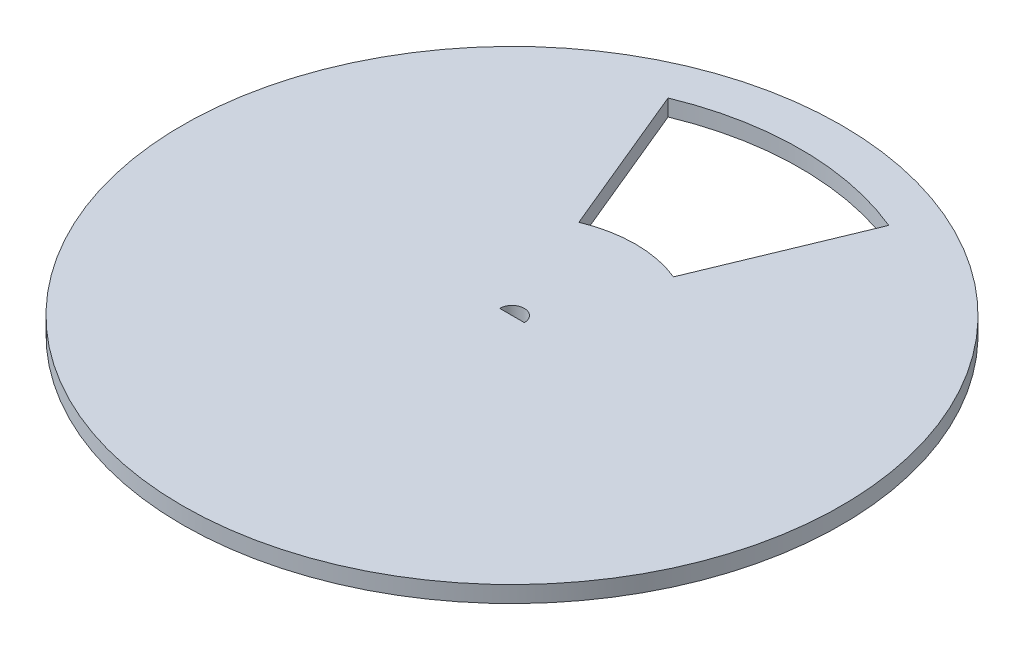
ISO-10303-21;
HEADER;
FILE_DESCRIPTION(('STEP AP214'),'2;1');
FILE_NAME('part.step','',(''),(''),'','','');
FILE_SCHEMA(('AUTOMOTIVE_DESIGN { 1 0 10303 214 1 1 1 1 }'));
ENDSEC;
DATA;
#1=APPLICATION_CONTEXT('core data for automotive mechanical design processes');
#2=APPLICATION_PROTOCOL_DEFINITION('international standard','automotive_design',2000,#1);
#3=PRODUCT_CONTEXT('',#1,'mechanical');
#4=PRODUCT('Part','Part','',(#3));
#5=PRODUCT_RELATED_PRODUCT_CATEGORY('part','',(#4));
#6=PRODUCT_DEFINITION_FORMATION('','',#4);
#7=PRODUCT_DEFINITION_CONTEXT('part definition',#1,'design');
#8=PRODUCT_DEFINITION('design','',#6,#7);
#9=PRODUCT_DEFINITION_SHAPE('','',#8);
#10=(LENGTH_UNIT() NAMED_UNIT(*) SI_UNIT(.MILLI.,.METRE.));
#11=(NAMED_UNIT(*) PLANE_ANGLE_UNIT() SI_UNIT($,.RADIAN.));
#12=(NAMED_UNIT(*) SI_UNIT($,.STERADIAN.) SOLID_ANGLE_UNIT());
#13=UNCERTAINTY_MEASURE_WITH_UNIT(LENGTH_MEASURE(1.E-05),#10,'distance_accuracy_value','');
#14=(GEOMETRIC_REPRESENTATION_CONTEXT(3) GLOBAL_UNCERTAINTY_ASSIGNED_CONTEXT((#13)) GLOBAL_UNIT_ASSIGNED_CONTEXT((#10,
#11,#12)) REPRESENTATION_CONTEXT('',''));
#15=CARTESIAN_POINT('',(0.,0.,0.));
#16=DIRECTION('',(0.,0.,1.));
#17=DIRECTION('',(1.,0.,0.));
#18=AXIS2_PLACEMENT_3D('',#15,#16,#17);
#19=CARTESIAN_POINT('',(0.,2.,0.));
#20=DIRECTION('',(0.,-1.,0.));
#21=DIRECTION('',(0.,0.,-1.));
#22=AXIS2_PLACEMENT_3D('',#19,#20,#21);
#23=CYLINDRICAL_SURFACE('',#22,40.);
#24=CARTESIAN_POINT('',(0.,2.,0.));
#25=DIRECTION('',(0.,1.,0.));
#26=DIRECTION('',(0.,0.,1.));
#27=AXIS2_PLACEMENT_3D('',#24,#25,#26);
#28=CIRCLE('',#27,40.);
#29=CARTESIAN_POINT('',(0.,2.,40.));
#30=VERTEX_POINT('',#29);
#31=EDGE_CURVE('E11',#30,#30,#28,.T.);
#32=ORIENTED_EDGE('',*,*,#31,.F.);
#33=EDGE_LOOP('',(#32));
#34=FACE_BOUND('',#33,.T.);
#35=CARTESIAN_POINT('',(0.,0.,0.));
#36=DIRECTION('',(0.,1.,0.));
#37=DIRECTION('',(0.,0.,1.));
#38=AXIS2_PLACEMENT_3D('',#35,#36,#37);
#39=CIRCLE('',#38,40.);
#40=CARTESIAN_POINT('',(0.,0.,40.));
#41=VERTEX_POINT('',#40);
#42=EDGE_CURVE('E42',#41,#41,#39,.T.);
#43=ORIENTED_EDGE('',*,*,#42,.T.);
#44=EDGE_LOOP('',(#43));
#45=FACE_BOUND('',#44,.T.);
#46=ADVANCED_FACE('F39',(#34,#45),#23,.T.);
#47=CARTESIAN_POINT('',(0.,2.,0.));
#48=DIRECTION('',(0.,1.,0.));
#49=DIRECTION('',(0.,0.,1.));
#50=AXIS2_PLACEMENT_3D('',#47,#48,#49);
#51=PLANE('',#50);
#52=CARTESIAN_POINT('',(0.,2.,0.));
#53=DIRECTION('',(0.,1.,0.));
#54=DIRECTION('',(0.,0.,-1.));
#55=AXIS2_PLACEMENT_3D('',#52,#53,#54);
#56=CIRCLE('',#55,1.5);
#57=CARTESIAN_POINT('',(1.5,2.,0.));
#58=VERTEX_POINT('',#57);
#59=CARTESIAN_POINT('',(-1.5,2.,0.));
#60=VERTEX_POINT('',#59);
#61=EDGE_CURVE('E54',#58,#60,#56,.T.);
#62=ORIENTED_EDGE('',*,*,#61,.F.);
#63=DIRECTION('',(1.,0.,0.));
#64=VECTOR('',#63,1.);
#65=CARTESIAN_POINT('',(-1.5,2.,0.));
#66=LINE('',#65,#64);
#67=EDGE_CURVE('E106',#60,#58,#66,.T.);
#68=ORIENTED_EDGE('',*,*,#67,.F.);
#69=EDGE_LOOP('',(#62,#68));
#70=FACE_BOUND('',#69,.T.);
#71=CARTESIAN_POINT('',(0.,2.,0.));
#72=DIRECTION('',(0.,1.,0.));
#73=DIRECTION('',(0.,0.,-1.));
#74=AXIS2_PLACEMENT_3D('',#71,#72,#73);
#75=CIRCLE('',#74,35.);
#76=CARTESIAN_POINT('',(13.3939201327782,2.,-32.335783637895));
#77=VERTEX_POINT('',#76);
#78=CARTESIAN_POINT('',(-13.3939201327782,2.,-32.335783637895));
#79=VERTEX_POINT('',#78);
#80=EDGE_CURVE('E126',#77,#79,#75,.T.);
#81=ORIENTED_EDGE('',*,*,#80,.F.);
#82=DIRECTION('',(0.382683432365091,0.,-0.923879532511287));
#83=VECTOR('',#82,1.);
#84=CARTESIAN_POINT('',(13.3939201327782,2.,-32.335783637895));
#85=LINE('',#84,#83);
#86=CARTESIAN_POINT('',(5.74025148547637,2.,-13.8581929876693));
#87=VERTEX_POINT('',#86);
#88=EDGE_CURVE('E137',#87,#77,#85,.T.);
#89=ORIENTED_EDGE('',*,*,#88,.F.);
#90=CARTESIAN_POINT('',(0.,2.,0.));
#91=DIRECTION('',(0.,-1.,0.));
#92=DIRECTION('',(0.,0.,1.));
#93=AXIS2_PLACEMENT_3D('',#90,#91,#92);
#94=CIRCLE('',#93,15.);
#95=CARTESIAN_POINT('',(-5.74025148547636,2.,-13.8581929876693));
#96=VERTEX_POINT('',#95);
#97=EDGE_CURVE('E133',#96,#87,#94,.T.);
#98=ORIENTED_EDGE('',*,*,#97,.F.);
#99=DIRECTION('',(0.382683432365091,0.,0.923879532511287));
#100=VECTOR('',#99,1.);
#101=CARTESIAN_POINT('',(-5.74025148547636,2.,-13.8581929876693));
#102=LINE('',#101,#100);
#103=EDGE_CURVE('E129',#79,#96,#102,.T.);
#104=ORIENTED_EDGE('',*,*,#103,.F.);
#105=EDGE_LOOP('',(#81,#89,#98,#104));
#106=FACE_BOUND('',#105,.T.);
#107=ORIENTED_EDGE('',*,*,#31,.T.);
#108=EDGE_LOOP('',(#107));
#109=FACE_BOUND('',#108,.T.);
#110=ADVANCED_FACE('F168',(#70,#106,#109),#51,.T.);
#111=CARTESIAN_POINT('',(0.,0.,0.));
#112=DIRECTION('',(0.,1.,0.));
#113=DIRECTION('',(0.,0.,1.));
#114=AXIS2_PLACEMENT_3D('',#111,#112,#113);
#115=PLANE('',#114);
#116=DIRECTION('',(1.,0.,0.));
#117=VECTOR('',#116,1.);
#118=CARTESIAN_POINT('',(-1.5,0.,0.));
#119=LINE('',#118,#117);
#120=CARTESIAN_POINT('',(-1.5,0.,0.));
#121=VERTEX_POINT('',#120);
#122=CARTESIAN_POINT('',(1.5,0.,0.));
#123=VERTEX_POINT('',#122);
#124=EDGE_CURVE('E96',#121,#123,#119,.T.);
#125=ORIENTED_EDGE('',*,*,#124,.T.);
#126=CARTESIAN_POINT('',(0.,0.,0.));
#127=DIRECTION('',(0.,1.,0.));
#128=DIRECTION('',(0.,0.,-1.));
#129=AXIS2_PLACEMENT_3D('',#126,#127,#128);
#130=CIRCLE('',#129,1.5);
#131=EDGE_CURVE('E59',#123,#121,#130,.T.);
#132=ORIENTED_EDGE('',*,*,#131,.T.);
#133=EDGE_LOOP('',(#125,#132));
#134=FACE_BOUND('',#133,.T.);
#135=DIRECTION('',(-0.382683432365091,0.,0.923879532511287));
#136=VECTOR('',#135,1.);
#137=CARTESIAN_POINT('',(13.3939201327782,0.,-32.335783637895));
#138=LINE('',#137,#136);
#139=CARTESIAN_POINT('',(13.3939201327782,0.,-32.335783637895));
#140=VERTEX_POINT('',#139);
#141=CARTESIAN_POINT('',(5.74025148547637,0.,-13.8581929876693));
#142=VERTEX_POINT('',#141);
#143=EDGE_CURVE('E118',#140,#142,#138,.T.);
#144=ORIENTED_EDGE('',*,*,#143,.F.);
#145=CARTESIAN_POINT('',(0.,0.,0.));
#146=DIRECTION('',(0.,1.,0.));
#147=DIRECTION('',(0.,0.,1.));
#148=AXIS2_PLACEMENT_3D('',#145,#146,#147);
#149=CIRCLE('',#148,35.);
#150=CARTESIAN_POINT('',(-13.3939201327782,0.,-32.335783637895));
#151=VERTEX_POINT('',#150);
#152=EDGE_CURVE('E122',#151,#140,#149,.F.);
#153=ORIENTED_EDGE('',*,*,#152,.F.);
#154=DIRECTION('',(-0.382683432365091,0.,-0.923879532511287));
#155=VECTOR('',#154,1.);
#156=CARTESIAN_POINT('',(-5.74025148547636,0.,-13.8581929876693));
#157=LINE('',#156,#155);
#158=CARTESIAN_POINT('',(-5.74025148547636,0.,-13.8581929876693));
#159=VERTEX_POINT('',#158);
#160=EDGE_CURVE('E145',#159,#151,#157,.T.);
#161=ORIENTED_EDGE('',*,*,#160,.F.);
#162=CARTESIAN_POINT('',(0.,0.,0.));
#163=DIRECTION('',(0.,1.,0.));
#164=DIRECTION('',(0.,0.,1.));
#165=AXIS2_PLACEMENT_3D('',#162,#163,#164);
#166=CIRCLE('',#165,15.);
#167=EDGE_CURVE('E114',#142,#159,#166,.T.);
#168=ORIENTED_EDGE('',*,*,#167,.F.);
#169=EDGE_LOOP('',(#144,#153,#161,#168));
#170=FACE_BOUND('',#169,.T.);
#171=ORIENTED_EDGE('',*,*,#42,.F.);
#172=EDGE_LOOP('',(#171));
#173=FACE_BOUND('',#172,.T.);
#174=ADVANCED_FACE('F103',(#134,#170,#173),#115,.F.);
#175=CARTESIAN_POINT('',(0.,-0.00100000000000013,0.));
#176=DIRECTION('',(0.,1.,0.));
#177=DIRECTION('',(0.,0.,1.));
#178=AXIS2_PLACEMENT_3D('',#175,#176,#177);
#179=CYLINDRICAL_SURFACE('',#178,35.);
#180=ORIENTED_EDGE('',*,*,#152,.T.);
#181=DIRECTION('',(0.,1.,0.));
#182=VECTOR('',#181,1.);
#183=CARTESIAN_POINT('',(13.3939201327782,-0.00100000000000013,-32.335783637895));
#184=LINE('',#183,#182);
#185=EDGE_CURVE('E142',#140,#77,#184,.T.);
#186=ORIENTED_EDGE('',*,*,#185,.T.);
#187=ORIENTED_EDGE('',*,*,#80,.T.);
#188=DIRECTION('',(0.,1.,0.));
#189=VECTOR('',#188,1.);
#190=CARTESIAN_POINT('',(-13.3939201327782,-0.00100000000000013,-32.335783637895));
#191=LINE('',#190,#189);
#192=EDGE_CURVE('E141',#151,#79,#191,.T.);
#193=ORIENTED_EDGE('',*,*,#192,.F.);
#194=EDGE_LOOP('',(#180,#186,#187,#193));
#195=FACE_BOUND('',#194,.T.);
#196=ADVANCED_FACE('F167',(#195),#179,.F.);
#197=CARTESIAN_POINT('',(13.3939201327782,-0.00100000000000013,-32.335783637895));
#198=DIRECTION('',(0.923879532511287,0.,0.382683432365091));
#199=DIRECTION('',(0.382683432365091,0.,-0.923879532511287));
#200=AXIS2_PLACEMENT_3D('',#197,#198,#199);
#201=PLANE('',#200);
#202=ORIENTED_EDGE('',*,*,#143,.T.);
#203=DIRECTION('',(0.,1.,0.));
#204=VECTOR('',#203,1.);
#205=CARTESIAN_POINT('',(5.74025148547637,-0.00100000000000013,-13.8581929876693));
#206=LINE('',#205,#204);
#207=EDGE_CURVE('E146',#142,#87,#206,.T.);
#208=ORIENTED_EDGE('',*,*,#207,.T.);
#209=ORIENTED_EDGE('',*,*,#88,.T.);
#210=ORIENTED_EDGE('',*,*,#185,.F.);
#211=EDGE_LOOP('',(#202,#208,#209,#210));
#212=FACE_BOUND('',#211,.T.);
#213=ADVANCED_FACE('F173',(#212),#201,.F.);
#214=CARTESIAN_POINT('',(0.,-0.00100000000000013,0.));
#215=DIRECTION('',(0.,1.,0.));
#216=DIRECTION('',(0.,0.,1.));
#217=AXIS2_PLACEMENT_3D('',#214,#215,#216);
#218=CYLINDRICAL_SURFACE('',#217,15.);
#219=ORIENTED_EDGE('',*,*,#167,.T.);
#220=DIRECTION('',(0.,1.,0.));
#221=VECTOR('',#220,1.);
#222=CARTESIAN_POINT('',(-5.74025148547636,-0.00100000000000013,-13.8581929876693));
#223=LINE('',#222,#221);
#224=EDGE_CURVE('E149',#159,#96,#223,.T.);
#225=ORIENTED_EDGE('',*,*,#224,.T.);
#226=ORIENTED_EDGE('',*,*,#97,.T.);
#227=ORIENTED_EDGE('',*,*,#207,.F.);
#228=EDGE_LOOP('',(#219,#225,#226,#227));
#229=FACE_BOUND('',#228,.T.);
#230=ADVANCED_FACE('F223',(#229),#218,.T.);
#231=CARTESIAN_POINT('',(-5.74025148547636,-0.00100000000000013,-13.8581929876693));
#232=DIRECTION('',(-0.923879532511286,0.,0.382683432365091));
#233=DIRECTION('',(0.382683432365091,0.,0.923879532511287));
#234=AXIS2_PLACEMENT_3D('',#231,#232,#233);
#235=PLANE('',#234);
#236=ORIENTED_EDGE('',*,*,#160,.T.);
#237=ORIENTED_EDGE('',*,*,#192,.T.);
#238=ORIENTED_EDGE('',*,*,#103,.T.);
#239=ORIENTED_EDGE('',*,*,#224,.F.);
#240=EDGE_LOOP('',(#236,#237,#238,#239));
#241=FACE_BOUND('',#240,.T.);
#242=ADVANCED_FACE('F195',(#241),#235,.F.);
#243=CARTESIAN_POINT('',(0.,0.,0.));
#244=DIRECTION('',(0.,1.,0.));
#245=DIRECTION('',(0.,0.,1.));
#246=AXIS2_PLACEMENT_3D('',#243,#244,#245);
#247=CYLINDRICAL_SURFACE('',#246,1.5);
#248=ORIENTED_EDGE('',*,*,#61,.T.);
#249=DIRECTION('',(0.,1.,0.));
#250=VECTOR('',#249,1.);
#251=CARTESIAN_POINT('',(-1.5,0.,0.));
#252=LINE('',#251,#250);
#253=EDGE_CURVE('E88',#121,#60,#252,.T.);
#254=ORIENTED_EDGE('',*,*,#253,.F.);
#255=ORIENTED_EDGE('',*,*,#131,.F.);
#256=DIRECTION('',(0.,1.,0.));
#257=VECTOR('',#256,1.);
#258=CARTESIAN_POINT('',(1.5,0.,0.));
#259=LINE('',#258,#257);
#260=EDGE_CURVE('E95',#123,#58,#259,.T.);
#261=ORIENTED_EDGE('',*,*,#260,.T.);
#262=EDGE_LOOP('',(#248,#254,#255,#261));
#263=FACE_BOUND('',#262,.T.);
#264=ADVANCED_FACE('F90',(#263),#247,.F.);
#265=CARTESIAN_POINT('',(-1.5,0.,0.));
#266=DIRECTION('',(0.,0.,1.));
#267=DIRECTION('',(1.,0.,0.));
#268=AXIS2_PLACEMENT_3D('',#265,#266,#267);
#269=PLANE('',#268);
#270=ORIENTED_EDGE('',*,*,#67,.T.);
#271=ORIENTED_EDGE('',*,*,#260,.F.);
#272=ORIENTED_EDGE('',*,*,#124,.F.);
#273=ORIENTED_EDGE('',*,*,#253,.T.);
#274=EDGE_LOOP('',(#270,#271,#272,#273));
#275=FACE_BOUND('',#274,.T.);
#276=ADVANCED_FACE('F99',(#275),#269,.F.);
#277=CLOSED_SHELL('',(#46,#110,#174,#196,#213,#230,#242,#264,#276));
#278=MANIFOLD_SOLID_BREP('B2',#277);
#279=ADVANCED_BREP_SHAPE_REPRESENTATION('',(#18,#278),#14);
#280=SHAPE_DEFINITION_REPRESENTATION(#9,#279);
ENDSEC;
END-ISO-10303-21;
